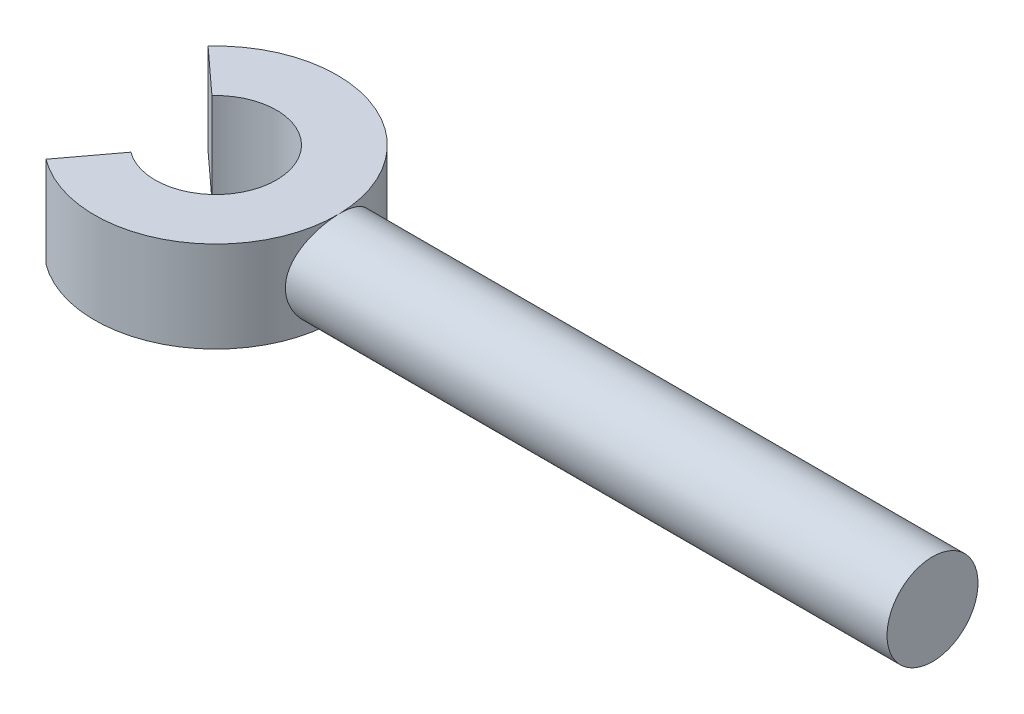
ISO-10303-21;
HEADER;
FILE_DESCRIPTION(('STEP AP214'),'2;1');
FILE_NAME('part.step','',(''),(''),'','','');
FILE_SCHEMA(('AUTOMOTIVE_DESIGN { 1 0 10303 214 1 1 1 1 }'));
ENDSEC;
DATA;
#1=APPLICATION_CONTEXT('core data for automotive mechanical design processes');
#2=APPLICATION_PROTOCOL_DEFINITION('international standard','automotive_design',2000,#1);
#3=PRODUCT_CONTEXT('',#1,'mechanical');
#4=PRODUCT('Part','Part','',(#3));
#5=PRODUCT_RELATED_PRODUCT_CATEGORY('part','',(#4));
#6=PRODUCT_DEFINITION_FORMATION('','',#4);
#7=PRODUCT_DEFINITION_CONTEXT('part definition',#1,'design');
#8=PRODUCT_DEFINITION('design','',#6,#7);
#9=PRODUCT_DEFINITION_SHAPE('','',#8);
#10=(LENGTH_UNIT() NAMED_UNIT(*) SI_UNIT(.MILLI.,.METRE.));
#11=(NAMED_UNIT(*) PLANE_ANGLE_UNIT() SI_UNIT($,.RADIAN.));
#12=(NAMED_UNIT(*) SI_UNIT($,.STERADIAN.) SOLID_ANGLE_UNIT());
#13=UNCERTAINTY_MEASURE_WITH_UNIT(LENGTH_MEASURE(1.E-05),#10,'distance_accuracy_value','');
#14=(GEOMETRIC_REPRESENTATION_CONTEXT(3) GLOBAL_UNCERTAINTY_ASSIGNED_CONTEXT((#13)) GLOBAL_UNIT_ASSIGNED_CONTEXT((#10,
#11,#12)) REPRESENTATION_CONTEXT('',''));
#15=CARTESIAN_POINT('',(0.,0.,0.));
#16=DIRECTION('',(0.,0.,1.));
#17=DIRECTION('',(1.,0.,0.));
#18=AXIS2_PLACEMENT_3D('',#15,#16,#17);
#19=CARTESIAN_POINT('',(-1.78624634650512,-0.75,0.0308326766493737));
#20=DIRECTION('',(0.,1.,0.));
#21=DIRECTION('',(0.,0.,1.));
#22=AXIS2_PLACEMENT_3D('',#19,#20,#21);
#23=CYLINDRICAL_SURFACE('',#22,2.);
#24=CARTESIAN_POINT('',(0.0799793528744298,0.,0.75));
#25=CARTESIAN_POINT('',(0.0799780110947038,-0.0406617406017281,0.750001453393518));
#26=CARTESIAN_POINT('',(0.0812677088118834,-0.0813136812313943,0.746682579968054));
#27=CARTESIAN_POINT('',(0.0862481635513889,-0.161396886735049,0.733551043569186));
#28=CARTESIAN_POINT('',(0.0899387988365902,-0.200828213392855,0.723738709839721));
#29=CARTESIAN_POINT('',(0.0992367206095355,-0.277297207986888,0.698019386421101));
#30=CARTESIAN_POINT('',(0.104839759869733,-0.314339965747308,0.682125892897447));
#31=CARTESIAN_POINT('',(0.117304418477089,-0.385251602038962,0.644739450254583));
#32=CARTESIAN_POINT('',(0.124166406629444,-0.419119546114018,0.623244859533639));
#33=CARTESIAN_POINT('',(0.138702624712196,-0.48427511385734,0.57420278629017));
#34=CARTESIAN_POINT('',(0.146398813476882,-0.51539578024524,0.546439908515243));
#35=CARTESIAN_POINT('',(0.161494855161868,-0.572656049154512,0.486102205226976));
#36=CARTESIAN_POINT('',(0.168894654714718,-0.598794757787434,0.453526518032464));
#37=CARTESIAN_POINT('',(0.182778218564757,-0.646061874550128,0.383332679882601));
#38=CARTESIAN_POINT('',(0.189229961444912,-0.667026724808222,0.345597507346405));
#39=CARTESIAN_POINT('',(0.20017547951431,-0.7022452015272,0.266851995053064));
#40=CARTESIAN_POINT('',(0.204669956905838,-0.71650123503845,0.2258428361529));
#41=CARTESIAN_POINT('',(0.210976168565635,-0.737281875764482,0.143640998509183));
#42=CARTESIAN_POINT('',(0.212897330275919,-0.744119315398068,0.102535934437633));
#43=CARTESIAN_POINT('',(0.214150941773061,-0.750889637500583,0.0197270256821793));
#44=CARTESIAN_POINT('',(0.213484148167273,-0.750824537830063,-0.0219766404442613));
#45=CARTESIAN_POINT('',(0.209676639361946,-0.743978769727133,-0.102789185640266));
#46=CARTESIAN_POINT('',(0.206649642896555,-0.737503197417151,-0.141929896787696));
#47=CARTESIAN_POINT('',(0.198524715693005,-0.718549660546229,-0.218500505542355));
#48=CARTESIAN_POINT('',(0.193426596610846,-0.70607115007036,-0.255930247212748));
#49=CARTESIAN_POINT('',(0.181496665066322,-0.675239193587127,-0.328862314417816));
#50=CARTESIAN_POINT('',(0.174632967581885,-0.656775873151361,-0.364312786125878));
#51=CARTESIAN_POINT('',(0.159842912352978,-0.614592590516808,-0.431691127447145));
#52=CARTESIAN_POINT('',(0.151916190961805,-0.59087082765172,-0.463617784765381));
#53=CARTESIAN_POINT('',(0.135214187664241,-0.537151700507982,-0.525104100761959));
#54=CARTESIAN_POINT('',(0.126416629668849,-0.506860058084205,-0.554401063445111));
#55=CARTESIAN_POINT('',(0.109328479553392,-0.441710676699644,-0.607585838943342));
#56=CARTESIAN_POINT('',(0.101038015900386,-0.406851787644861,-0.631472285169692));
#57=CARTESIAN_POINT('',(0.0857365574287194,-0.332638634234645,-0.673577359439103));
#58=CARTESIAN_POINT('',(0.0787541725087002,-0.293208976736387,-0.691674292374313));
#59=CARTESIAN_POINT('',(0.067184318505784,-0.21151089058843,-0.720861674927376));
#60=CARTESIAN_POINT('',(0.0625953448432009,-0.169244264263811,-0.731956527214951));
#61=CARTESIAN_POINT('',(0.0566550094283584,-0.0858590198034669,-0.746194169348846));
#62=CARTESIAN_POINT('',(0.0551218092631793,-0.0448297863044944,-0.749784249418015));
#63=CARTESIAN_POINT('',(0.0549472323685401,0.0372632584437594,-0.750196666528726));
#64=CARTESIAN_POINT('',(0.0563051015452812,0.0783270578842891,-0.747020768378108));
#65=CARTESIAN_POINT('',(0.0615865518643515,0.157141917411603,-0.734383465592338));
#66=CARTESIAN_POINT('',(0.0653765241630524,0.194955367686041,-0.725248989836813));
#67=CARTESIAN_POINT('',(0.0749513747020551,0.26849276361679,-0.701360918277341));
#68=CARTESIAN_POINT('',(0.0807366776116729,0.304216262570914,-0.68660612622287));
#69=CARTESIAN_POINT('',(0.0939588605799082,0.374178552811246,-0.651221575938029));
#70=CARTESIAN_POINT('',(0.101453491510926,0.40829731255634,-0.630376692498537));
#71=CARTESIAN_POINT('',(0.117178715766585,0.472700142980177,-0.583642864281471));
#72=CARTESIAN_POINT('',(0.125409593777237,0.502982719283623,-0.557751963749755));
#73=CARTESIAN_POINT('',(0.142401759774391,0.561037082998116,-0.499541456928678));
#74=CARTESIAN_POINT('',(0.151160177370718,0.588488353562264,-0.466900222716169));
#75=CARTESIAN_POINT('',(0.167725147807027,0.637564089808355,-0.397273027331069));
#76=CARTESIAN_POINT('',(0.175531663555572,0.659188328476141,-0.36028689696713));
#77=CARTESIAN_POINT('',(0.189387581767763,0.695926982063989,-0.282879096178739));
#78=CARTESIAN_POINT('',(0.195436500810039,0.711039606536205,-0.242456484505229));
#79=CARTESIAN_POINT('',(0.205128911045755,0.73414163330584,-0.159353403507651));
#80=CARTESIAN_POINT('',(0.208773571596779,0.742134499099176,-0.116674042723852));
#81=CARTESIAN_POINT('',(0.21314663389505,0.750379763209888,-0.0330183302258103));
#82=CARTESIAN_POINT('',(0.214036519471829,0.751066800605641,0.00790706678253594));
#83=CARTESIAN_POINT('',(0.2133128969252,0.745780251139777,0.0892984056120083));
#84=CARTESIAN_POINT('',(0.211699760249457,0.739807652602915,0.129764414708504));
#85=CARTESIAN_POINT('',(0.206275803868741,0.721697656982858,0.207879725043138));
#86=CARTESIAN_POINT('',(0.202530260943978,0.709744594356545,0.245576717022248));
#87=CARTESIAN_POINT('',(0.193305955176579,0.680174571945222,0.318448735788933));
#88=CARTESIAN_POINT('',(0.187826892053358,0.662556630880652,0.353623324349643));
#89=CARTESIAN_POINT('',(0.175461604058879,0.621393449630201,0.421924502020468));
#90=CARTESIAN_POINT('',(0.168529691828482,0.59764782419293,0.454921868936088));
#91=CARTESIAN_POINT('',(0.154123523735076,0.545219544104187,0.516599710461945));
#92=CARTESIAN_POINT('',(0.146649086561418,0.516535234520171,0.545278731954288));
#93=CARTESIAN_POINT('',(0.131554432194099,0.45327731787506,0.599041135337092));
#94=CARTESIAN_POINT('',(0.123946853361018,0.418474992716334,0.623859912122088));
#95=CARTESIAN_POINT('',(0.109909980695978,0.344975952140127,0.667318872872018));
#96=CARTESIAN_POINT('',(0.103480853293857,0.306278687843474,0.685958184426196));
#97=CARTESIAN_POINT('',(0.0923669753378255,0.22395112672711,0.717202867826279));
#98=CARTESIAN_POINT('',(0.0877878344443782,0.18016992797756,0.729452278236109));
#99=CARTESIAN_POINT('',(0.081595668822852,0.0909210470892367,0.745847584998054));
#100=CARTESIAN_POINT('',(0.0799808528051264,0.0454544003963266,0.749998375299978));
#101=CARTESIAN_POINT('',(0.0799793528744298,0.,0.75));
#102=B_SPLINE_CURVE_WITH_KNOTS('',3,(#24,#25,#26,#27,#28,#29,#30,#31,#32,#33,#34,#35,#36,#37,
#38,#39,#40,#41,#42,#43,#44,#45,#46,#47,#48,#49,#50,#51,#52,#53,#54,#55,#56,#57,#58,#59,#60,#61,
#62,#63,#64,#65,#66,#67,#68,#69,#70,#71,#72,#73,#74,#75,#76,#77,#78,#79,#80,#81,#82,#83,#84,#85,
#86,#87,#88,#89,#90,#91,#92,#93,#94,#95,#96,#97,#98,#99,#100,#101),.UNSPECIFIED.,.T.,.F.,(4,2,2,
2,2,2,2,2,2,2,2,2,2,2,2,2,2,2,2,2,2,2,2,2,2,2,2,2,2,2,2,2,2,2,2,2,2,2,4),(0.,0.121816707356574,
0.243627238600881,0.365168984302918,0.486746392301951,0.613404038762038,0.740084389438123,
0.87036602902577,1.00060088927502,1.1251004015649,1.24956351826896,1.36837461846494,
1.48719652553857,1.60833674191335,1.72951850500169,1.85808286921967,1.98667967011559,
2.11782478487493,2.2488873576855,2.37188556530936,2.49485169455268,2.61158176454926,
2.72833669373463,2.84985492423788,2.97142034723193,3.10142994625374,3.23144460956119,
3.36149499921004,3.4914820896109,3.61368940043482,3.73587857746909,3.85451427917152,
3.97317054222628,4.09635096165259,4.21957273894939,4.34920361776921,4.47885278996189,
4.61510997945621,4.75128480397694),.UNSPECIFIED.);
#103=CARTESIAN_POINT('',(0.213515975885174,-0.750000000000797,0.));
#104=VERTEX_POINT('',#103);
#105=CARTESIAN_POINT('',(0.213515975884876,0.75,0.));
#106=VERTEX_POINT('',#105);
#107=EDGE_CURVE('E11',#104,#106,#102,.T.);
#108=ORIENTED_EDGE('',*,*,#107,.F.);
#109=CARTESIAN_POINT('',(-1.78624634650512,-0.75,0.0308326766493737));
#110=DIRECTION('',(0.,1.,0.));
#111=DIRECTION('',(0.,0.,-1.));
#112=AXIS2_PLACEMENT_3D('',#109,#110,#111);
#113=CIRCLE('',#112,2.);
#114=CARTESIAN_POINT('',(-3.2625730314672,-0.75,-1.31841137809717));
#115=VERTEX_POINT('',#114);
#116=EDGE_CURVE('E108',#104,#115,#113,.T.);
#117=ORIENTED_EDGE('',*,*,#116,.T.);
#118=DIRECTION('',(0.,1.,0.));
#119=VECTOR('',#118,1.);
#120=CARTESIAN_POINT('',(-3.2625730314672,-0.75,-1.31841137809717));
#121=LINE('',#120,#119);
#122=CARTESIAN_POINT('',(-3.2625730314672,0.75,-1.31841137809717));
#123=VERTEX_POINT('',#122);
#124=EDGE_CURVE('E107',#115,#123,#121,.T.);
#125=ORIENTED_EDGE('',*,*,#124,.T.);
#126=CARTESIAN_POINT('',(-1.78624634650512,0.75,0.0308326766493737));
#127=DIRECTION('',(0.,1.,0.));
#128=DIRECTION('',(0.,0.,-1.));
#129=AXIS2_PLACEMENT_3D('',#126,#127,#128);
#130=CIRCLE('',#129,2.);
#131=EDGE_CURVE('E93',#106,#123,#130,.T.);
#132=ORIENTED_EDGE('',*,*,#131,.F.);
#133=EDGE_LOOP('',(#108,#117,#125,#132));
#134=FACE_BOUND('',#133,.T.);
#135=ADVANCED_FACE('F41',(#134),#23,.T.);
#136=EDGE_CURVE('E46',#106,#104,#102,.T.);
#137=ORIENTED_EDGE('',*,*,#136,.F.);
#138=CARTESIAN_POINT('',(-2.98372598641487,0.75,1.63271984870664));
#139=VERTEX_POINT('',#138);
#140=EDGE_CURVE('E101',#139,#106,#130,.T.);
#141=ORIENTED_EDGE('',*,*,#140,.F.);
#142=DIRECTION('',(0.,1.,0.));
#143=VECTOR('',#142,1.);
#144=CARTESIAN_POINT('',(-2.98372598641487,-0.75,1.63271984870664));
#145=LINE('',#144,#143);
#146=CARTESIAN_POINT('',(-2.98372598641487,-0.75,1.63271984870664));
#147=VERTEX_POINT('',#146);
#148=EDGE_CURVE('E139',#147,#139,#145,.T.);
#149=ORIENTED_EDGE('',*,*,#148,.F.);
#150=EDGE_CURVE('E62',#147,#104,#113,.T.);
#151=ORIENTED_EDGE('',*,*,#150,.T.);
#152=EDGE_LOOP('',(#137,#141,#149,#151));
#153=FACE_BOUND('',#152,.T.);
#154=ADVANCED_FACE('F164',(#153),#23,.T.);
#155=CARTESIAN_POINT('',(-2.38498616646,-0.75,0.831776262678005));
#156=DIRECTION('',(-0.800943586028632,0.,-0.598739819954875));
#157=DIRECTION('',(-0.598739819954875,0.,0.800943586028632));
#158=AXIS2_PLACEMENT_3D('',#155,#156,#157);
#159=PLANE('',#158);
#160=ORIENTED_EDGE('',*,*,#148,.T.);
#161=DIRECTION('',(-0.598739819954875,0.,0.800943586028632));
#162=VECTOR('',#161,1.);
#163=CARTESIAN_POINT('',(-2.38498616646,0.75,0.831776262678005));
#164=LINE('',#163,#162);
#165=CARTESIAN_POINT('',(-2.38498616646,0.75,0.831776262678005));
#166=VERTEX_POINT('',#165);
#167=EDGE_CURVE('E122',#166,#139,#164,.T.);
#168=ORIENTED_EDGE('',*,*,#167,.F.);
#169=DIRECTION('',(0.,1.,0.));
#170=VECTOR('',#169,1.);
#171=CARTESIAN_POINT('',(-2.38498616646,-0.75,0.831776262678005));
#172=LINE('',#171,#170);
#173=CARTESIAN_POINT('',(-2.38498616646,-0.75,0.831776262678005));
#174=VERTEX_POINT('',#173);
#175=EDGE_CURVE('E143',#174,#166,#172,.T.);
#176=ORIENTED_EDGE('',*,*,#175,.F.);
#177=DIRECTION('',(-0.598739819954875,0.,0.800943586028632));
#178=VECTOR('',#177,1.);
#179=CARTESIAN_POINT('',(-2.38498616646,-0.75,0.831776262678005));
#180=LINE('',#179,#178);
#181=EDGE_CURVE('E114',#174,#147,#180,.T.);
#182=ORIENTED_EDGE('',*,*,#181,.T.);
#183=EDGE_LOOP('',(#160,#168,#176,#182));
#184=FACE_BOUND('',#183,.T.);
#185=ADVANCED_FACE('F168',(#184),#159,.T.);
#186=CARTESIAN_POINT('',(-1.78624634650512,-0.75,0.0308326766493737));
#187=DIRECTION('',(0.,1.,0.));
#188=DIRECTION('',(0.,0.,1.));
#189=AXIS2_PLACEMENT_3D('',#186,#187,#188);
#190=CYLINDRICAL_SURFACE('',#189,1.);
#191=ORIENTED_EDGE('',*,*,#175,.T.);
#192=CARTESIAN_POINT('',(-1.78624634650512,0.75,0.0308326766493737));
#193=DIRECTION('',(0.,-1.,0.));
#194=DIRECTION('',(0.,0.,-1.));
#195=AXIS2_PLACEMENT_3D('',#192,#193,#194);
#196=CIRCLE('',#195,1.);
#197=CARTESIAN_POINT('',(-2.52440968898616,0.75,-0.643789350723897));
#198=VERTEX_POINT('',#197);
#199=EDGE_CURVE('E118',#198,#166,#196,.T.);
#200=ORIENTED_EDGE('',*,*,#199,.F.);
#201=DIRECTION('',(0.,1.,0.));
#202=VECTOR('',#201,1.);
#203=CARTESIAN_POINT('',(-2.52440968898616,-0.75,-0.643789350723897));
#204=LINE('',#203,#202);
#205=CARTESIAN_POINT('',(-2.52440968898616,-0.75,-0.643789350723897));
#206=VERTEX_POINT('',#205);
#207=EDGE_CURVE('E113',#206,#198,#204,.T.);
#208=ORIENTED_EDGE('',*,*,#207,.F.);
#209=CARTESIAN_POINT('',(-1.78624634650512,-0.75,0.0308326766493737));
#210=DIRECTION('',(0.,-1.,0.));
#211=DIRECTION('',(0.,0.,-1.));
#212=AXIS2_PLACEMENT_3D('',#209,#210,#211);
#213=CIRCLE('',#212,1.);
#214=EDGE_CURVE('E132',#206,#174,#213,.T.);
#215=ORIENTED_EDGE('',*,*,#214,.T.);
#216=EDGE_LOOP('',(#191,#200,#208,#215));
#217=FACE_BOUND('',#216,.T.);
#218=ADVANCED_FACE('F173',(#217),#190,.F.);
#219=CARTESIAN_POINT('',(-2.52440968898616,-0.75,-0.643789350723897));
#220=DIRECTION('',(-0.674622027373269,0.,0.738163342481039));
#221=DIRECTION('',(0.738163342481039,0.,0.674622027373269));
#222=AXIS2_PLACEMENT_3D('',#219,#220,#221);
#223=PLANE('',#222);
#224=ORIENTED_EDGE('',*,*,#207,.T.);
#225=DIRECTION('',(0.738163342481039,0.,0.674622027373269));
#226=VECTOR('',#225,1.);
#227=CARTESIAN_POINT('',(-2.52440968898616,0.75,-0.643789350723897));
#228=LINE('',#227,#226);
#229=EDGE_CURVE('E98',#123,#198,#228,.T.);
#230=ORIENTED_EDGE('',*,*,#229,.F.);
#231=ORIENTED_EDGE('',*,*,#124,.F.);
#232=DIRECTION('',(0.738163342481039,0.,0.674622027373269));
#233=VECTOR('',#232,1.);
#234=CARTESIAN_POINT('',(-2.52440968898616,-0.75,-0.643789350723897));
#235=LINE('',#234,#233);
#236=EDGE_CURVE('E129',#115,#206,#235,.T.);
#237=ORIENTED_EDGE('',*,*,#236,.T.);
#238=EDGE_LOOP('',(#224,#230,#231,#237));
#239=FACE_BOUND('',#238,.T.);
#240=ADVANCED_FACE('F116',(#239),#223,.T.);
#241=CARTESIAN_POINT('',(-1.78624634650512,-0.75,0.0308326766493737));
#242=DIRECTION('',(0.,-1.,0.));
#243=DIRECTION('',(0.,0.,-1.));
#244=AXIS2_PLACEMENT_3D('',#241,#242,#243);
#245=PLANE('',#244);
#246=ORIENTED_EDGE('',*,*,#150,.F.);
#247=ORIENTED_EDGE('',*,*,#181,.F.);
#248=ORIENTED_EDGE('',*,*,#214,.F.);
#249=ORIENTED_EDGE('',*,*,#236,.F.);
#250=ORIENTED_EDGE('',*,*,#116,.F.);
#251=EDGE_LOOP('',(#246,#247,#248,#249,#250));
#252=FACE_BOUND('',#251,.T.);
#253=ADVANCED_FACE('F161',(#252),#245,.T.);
#254=CARTESIAN_POINT('',(-1.78624634650512,0.75,0.0308326766493737));
#255=DIRECTION('',(0.,-1.,0.));
#256=DIRECTION('',(0.,0.,-1.));
#257=AXIS2_PLACEMENT_3D('',#254,#255,#256);
#258=PLANE('',#257);
#259=ORIENTED_EDGE('',*,*,#140,.T.);
#260=ORIENTED_EDGE('',*,*,#131,.T.);
#261=ORIENTED_EDGE('',*,*,#229,.T.);
#262=ORIENTED_EDGE('',*,*,#199,.T.);
#263=ORIENTED_EDGE('',*,*,#167,.T.);
#264=EDGE_LOOP('',(#259,#260,#261,#262,#263));
#265=FACE_BOUND('',#264,.T.);
#266=ADVANCED_FACE('F95',(#265),#258,.F.);
#267=CARTESIAN_POINT('',(10.,0.,0.));
#268=DIRECTION('',(-1.,0.,0.));
#269=DIRECTION('',(0.,0.,1.));
#270=AXIS2_PLACEMENT_3D('',#267,#268,#269);
#271=CYLINDRICAL_SURFACE('',#270,0.75);
#272=CARTESIAN_POINT('',(10.,0.,0.));
#273=DIRECTION('',(1.,0.,0.));
#274=DIRECTION('',(0.,0.,-1.));
#275=AXIS2_PLACEMENT_3D('',#272,#273,#274);
#276=CIRCLE('',#275,0.75);
#277=CARTESIAN_POINT('',(10.,0.,-0.75));
#278=VERTEX_POINT('',#277);
#279=EDGE_CURVE('E142',#278,#278,#276,.T.);
#280=ORIENTED_EDGE('',*,*,#279,.F.);
#281=EDGE_LOOP('',(#280));
#282=FACE_BOUND('',#281,.T.);
#283=ORIENTED_EDGE('',*,*,#136,.T.);
#284=ORIENTED_EDGE('',*,*,#107,.T.);
#285=EDGE_LOOP('',(#283,#284));
#286=FACE_BOUND('',#285,.T.);
#287=ADVANCED_FACE('F43',(#282,#286),#271,.T.);
#288=CARTESIAN_POINT('',(10.,0.,0.));
#289=DIRECTION('',(1.,0.,0.));
#290=DIRECTION('',(0.,0.,-1.));
#291=AXIS2_PLACEMENT_3D('',#288,#289,#290);
#292=PLANE('',#291);
#293=ORIENTED_EDGE('',*,*,#279,.T.);
#294=EDGE_LOOP('',(#293));
#295=FACE_BOUND('',#294,.T.);
#296=ADVANCED_FACE('F154',(#295),#292,.T.);
#297=CLOSED_SHELL('',(#135,#154,#185,#218,#240,#253,#266,#287,#296));
#298=MANIFOLD_SOLID_BREP('B2',#297);
#299=ADVANCED_BREP_SHAPE_REPRESENTATION('',(#18,#298),#14);
#300=SHAPE_DEFINITION_REPRESENTATION(#9,#299);
ENDSEC;
END-ISO-10303-21;
